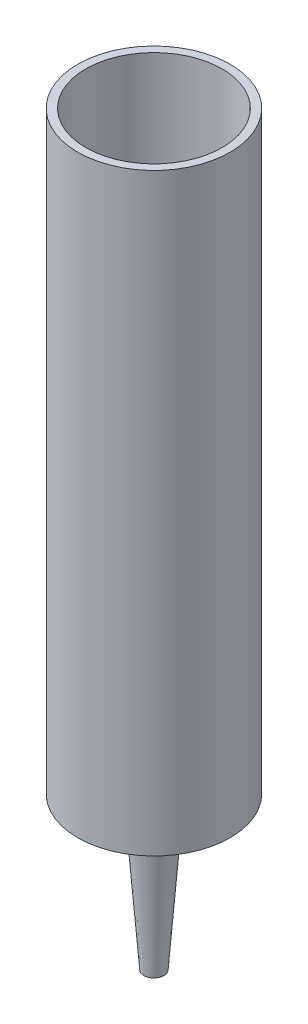
ISO-10303-21;
HEADER;
FILE_DESCRIPTION(('STEP AP214'),'2;1');
FILE_NAME('part.step','',(''),(''),'','','');
FILE_SCHEMA(('AUTOMOTIVE_DESIGN { 1 0 10303 214 1 1 1 1 }'));
ENDSEC;
DATA;
#1=APPLICATION_CONTEXT('core data for automotive mechanical design processes');
#2=APPLICATION_PROTOCOL_DEFINITION('international standard','automotive_design',2000,#1);
#3=PRODUCT_CONTEXT('',#1,'mechanical');
#4=PRODUCT('Part','Part','',(#3));
#5=PRODUCT_RELATED_PRODUCT_CATEGORY('part','',(#4));
#6=PRODUCT_DEFINITION_FORMATION('','',#4);
#7=PRODUCT_DEFINITION_CONTEXT('part definition',#1,'design');
#8=PRODUCT_DEFINITION('design','',#6,#7);
#9=PRODUCT_DEFINITION_SHAPE('','',#8);
#10=(LENGTH_UNIT() NAMED_UNIT(*) SI_UNIT(.MILLI.,.METRE.));
#11=(NAMED_UNIT(*) PLANE_ANGLE_UNIT() SI_UNIT($,.RADIAN.));
#12=(NAMED_UNIT(*) SI_UNIT($,.STERADIAN.) SOLID_ANGLE_UNIT());
#13=UNCERTAINTY_MEASURE_WITH_UNIT(LENGTH_MEASURE(1.E-05),#10,'distance_accuracy_value','');
#14=(GEOMETRIC_REPRESENTATION_CONTEXT(3) GLOBAL_UNCERTAINTY_ASSIGNED_CONTEXT((#13)) GLOBAL_UNIT_ASSIGNED_CONTEXT((#10,
#11,#12)) REPRESENTATION_CONTEXT('',''));
#15=CARTESIAN_POINT('',(0.,0.,0.));
#16=DIRECTION('',(0.,0.,1.));
#17=DIRECTION('',(1.,0.,0.));
#18=AXIS2_PLACEMENT_3D('',#15,#16,#17);
#19=CARTESIAN_POINT('',(0.,148.,0.));
#20=DIRECTION('',(0.,1.,0.));
#21=DIRECTION('',(0.,0.,1.));
#22=AXIS2_PLACEMENT_3D('',#19,#20,#21);
#23=PLANE('',#22);
#24=CARTESIAN_POINT('',(0.,148.,0.));
#25=DIRECTION('',(0.,1.,0.));
#26=DIRECTION('',(0.,0.,1.));
#27=AXIS2_PLACEMENT_3D('',#24,#25,#26);
#28=CIRCLE('',#27,19.);
#29=CARTESIAN_POINT('',(0.,148.,19.));
#30=VERTEX_POINT('',#29);
#31=EDGE_CURVE('E10',#30,#30,#28,.T.);
#32=ORIENTED_EDGE('',*,*,#31,.T.);
#33=EDGE_LOOP('',(#32));
#34=FACE_BOUND('',#33,.T.);
#35=CARTESIAN_POINT('',(0.,148.,0.));
#36=DIRECTION('',(0.,1.,0.));
#37=DIRECTION('',(0.,0.,1.));
#38=AXIS2_PLACEMENT_3D('',#35,#36,#37);
#39=CIRCLE('',#38,17.);
#40=CARTESIAN_POINT('',(0.,148.,17.));
#41=VERTEX_POINT('',#40);
#42=EDGE_CURVE('E46',#41,#41,#39,.T.);
#43=ORIENTED_EDGE('',*,*,#42,.F.);
#44=EDGE_LOOP('',(#43));
#45=FACE_BOUND('',#44,.T.);
#46=ADVANCED_FACE('F39',(#34,#45),#23,.T.);
#47=CARTESIAN_POINT('',(0.,148.,0.));
#48=DIRECTION('',(0.,-1.,0.));
#49=DIRECTION('',(0.,0.,-1.));
#50=AXIS2_PLACEMENT_3D('',#47,#48,#49);
#51=CYLINDRICAL_SURFACE('',#50,19.);
#52=ORIENTED_EDGE('',*,*,#31,.F.);
#53=EDGE_LOOP('',(#52));
#54=FACE_BOUND('',#53,.T.);
#55=CARTESIAN_POINT('',(0.,0.,0.));
#56=DIRECTION('',(0.,1.,0.));
#57=DIRECTION('',(0.,0.,1.));
#58=AXIS2_PLACEMENT_3D('',#55,#56,#57);
#59=CIRCLE('',#58,19.);
#60=CARTESIAN_POINT('',(0.,0.,19.));
#61=VERTEX_POINT('',#60);
#62=EDGE_CURVE('E55',#61,#61,#59,.T.);
#63=ORIENTED_EDGE('',*,*,#62,.T.);
#64=EDGE_LOOP('',(#63));
#65=FACE_BOUND('',#64,.T.);
#66=ADVANCED_FACE('F41',(#54,#65),#51,.T.);
#67=CARTESIAN_POINT('',(0.,148.,0.));
#68=DIRECTION('',(0.,-1.,0.));
#69=DIRECTION('',(0.,0.,-1.));
#70=AXIS2_PLACEMENT_3D('',#67,#68,#69);
#71=CYLINDRICAL_SURFACE('',#70,17.);
#72=ORIENTED_EDGE('',*,*,#42,.T.);
#73=EDGE_LOOP('',(#72));
#74=FACE_BOUND('',#73,.T.);
#75=CARTESIAN_POINT('',(0.,0.,0.));
#76=DIRECTION('',(0.,1.,0.));
#77=DIRECTION('',(0.,0.,1.));
#78=AXIS2_PLACEMENT_3D('',#75,#76,#77);
#79=CIRCLE('',#78,17.);
#80=CARTESIAN_POINT('',(0.,0.,17.));
#81=VERTEX_POINT('',#80);
#82=EDGE_CURVE('E50',#81,#81,#79,.T.);
#83=ORIENTED_EDGE('',*,*,#82,.F.);
#84=EDGE_LOOP('',(#83));
#85=FACE_BOUND('',#84,.T.);
#86=ADVANCED_FACE('F90',(#74,#85),#71,.F.);
#87=CARTESIAN_POINT('',(0.,0.,0.));
#88=DIRECTION('',(0.,1.,0.));
#89=DIRECTION('',(0.,0.,1.));
#90=AXIS2_PLACEMENT_3D('',#87,#88,#89);
#91=CONICAL_SURFACE('',#90,19.,1.22777238637419);
#92=CARTESIAN_POINT('',(0.,-5.,0.));
#93=DIRECTION('',(0.,1.,0.));
#94=DIRECTION('',(0.,0.,1.));
#95=AXIS2_PLACEMENT_3D('',#92,#93,#94);
#96=CIRCLE('',#95,5.);
#97=CARTESIAN_POINT('',(0.,-5.,5.));
#98=VERTEX_POINT('',#97);
#99=EDGE_CURVE('E68',#98,#98,#96,.T.);
#100=CARTESIAN_POINT('',(0.,-5.,5.));
#101=CARTESIAN_POINT('',(0.,-4.94791666666666,5.14583333333334));
#102=CARTESIAN_POINT('',(0.,-4.89583333333333,5.29166666666667));
#103=CARTESIAN_POINT('',(0.,-4.79166666666666,5.58333333333334));
#104=CARTESIAN_POINT('',(0.,-4.73958333333333,5.72916666666667));
#105=CARTESIAN_POINT('',(0.,-4.63541666666666,6.02083333333334));
#106=CARTESIAN_POINT('',(0.,-4.58333333333333,6.16666666666667));
#107=CARTESIAN_POINT('',(0.,-4.47916666666666,6.45833333333334));
#108=CARTESIAN_POINT('',(0.,-4.42708333333333,6.60416666666667));
#109=CARTESIAN_POINT('',(0.,-4.32291666666666,6.89583333333334));
#110=CARTESIAN_POINT('',(0.,-4.27083333333333,7.04166666666667));
#111=CARTESIAN_POINT('',(0.,-4.16666666666666,7.33333333333333));
#112=CARTESIAN_POINT('',(0.,-4.11458333333333,7.47916666666667));
#113=CARTESIAN_POINT('',(0.,-4.01041666666666,7.77083333333334));
#114=CARTESIAN_POINT('',(0.,-3.95833333333333,7.91666666666667));
#115=CARTESIAN_POINT('',(0.,-3.85416666666666,8.20833333333334));
#116=CARTESIAN_POINT('',(0.,-3.80208333333333,8.35416666666667));
#117=CARTESIAN_POINT('',(0.,-3.69791666666666,8.64583333333334));
#118=CARTESIAN_POINT('',(0.,-3.64583333333333,8.79166666666667));
#119=CARTESIAN_POINT('',(0.,-3.54166666666666,9.08333333333334));
#120=CARTESIAN_POINT('',(0.,-3.48958333333333,9.22916666666667));
#121=CARTESIAN_POINT('',(0.,-3.38541666666666,9.52083333333334));
#122=CARTESIAN_POINT('',(0.,-3.33333333333333,9.66666666666667));
#123=CARTESIAN_POINT('',(0.,-3.22916666666666,9.95833333333333));
#124=CARTESIAN_POINT('',(0.,-3.17708333333333,10.1041666666667));
#125=CARTESIAN_POINT('',(0.,-3.07291666666666,10.3958333333333));
#126=CARTESIAN_POINT('',(0.,-3.02083333333333,10.5416666666667));
#127=CARTESIAN_POINT('',(0.,-2.91666666666666,10.8333333333333));
#128=CARTESIAN_POINT('',(0.,-2.86458333333333,10.9791666666667));
#129=CARTESIAN_POINT('',(0.,-2.76041666666666,11.2708333333333));
#130=CARTESIAN_POINT('',(0.,-2.70833333333333,11.4166666666667));
#131=CARTESIAN_POINT('',(0.,-2.60416666666666,11.7083333333333));
#132=CARTESIAN_POINT('',(0.,-2.55208333333333,11.8541666666667));
#133=CARTESIAN_POINT('',(0.,-2.44791666666666,12.1458333333333));
#134=CARTESIAN_POINT('',(0.,-2.39583333333333,12.2916666666667));
#135=CARTESIAN_POINT('',(0.,-2.29166666666666,12.5833333333333));
#136=CARTESIAN_POINT('',(0.,-2.23958333333333,12.7291666666667));
#137=CARTESIAN_POINT('',(0.,-2.13541666666666,13.0208333333333));
#138=CARTESIAN_POINT('',(0.,-2.08333333333333,13.1666666666667));
#139=CARTESIAN_POINT('',(0.,-1.97916666666667,13.4583333333333));
#140=CARTESIAN_POINT('',(0.,-1.92708333333333,13.6041666666667));
#141=CARTESIAN_POINT('',(0.,-1.82291666666666,13.8958333333333));
#142=CARTESIAN_POINT('',(0.,-1.77083333333333,14.0416666666667));
#143=CARTESIAN_POINT('',(0.,-1.66666666666667,14.3333333333333));
#144=CARTESIAN_POINT('',(0.,-1.61458333333333,14.4791666666667));
#145=CARTESIAN_POINT('',(0.,-1.51041666666667,14.7708333333333));
#146=CARTESIAN_POINT('',(0.,-1.45833333333333,14.9166666666667));
#147=CARTESIAN_POINT('',(0.,-1.35416666666667,15.2083333333333));
#148=CARTESIAN_POINT('',(0.,-1.30208333333333,15.3541666666667));
#149=CARTESIAN_POINT('',(0.,-1.19791666666667,15.6458333333333));
#150=CARTESIAN_POINT('',(0.,-1.14583333333333,15.7916666666667));
#151=CARTESIAN_POINT('',(0.,-1.04166666666667,16.0833333333333));
#152=CARTESIAN_POINT('',(0.,-0.989583333333333,16.2291666666667));
#153=CARTESIAN_POINT('',(0.,-0.885416666666666,16.5208333333333));
#154=CARTESIAN_POINT('',(0.,-0.833333333333332,16.6666666666667));
#155=CARTESIAN_POINT('',(0.,-0.729166666666666,16.9583333333333));
#156=CARTESIAN_POINT('',(0.,-0.677083333333332,17.1041666666667));
#157=CARTESIAN_POINT('',(0.,-0.572916666666666,17.3958333333333));
#158=CARTESIAN_POINT('',(0.,-0.520833333333333,17.5416666666667));
#159=CARTESIAN_POINT('',(0.,-0.416666666666666,17.8333333333333));
#160=CARTESIAN_POINT('',(0.,-0.364583333333333,17.9791666666667));
#161=CARTESIAN_POINT('',(0.,-0.260416666666666,18.2708333333333));
#162=CARTESIAN_POINT('',(0.,-0.208333333333333,18.4166666666667));
#163=CARTESIAN_POINT('',(0.,-0.104166666666667,18.7083333333333));
#164=CARTESIAN_POINT('',(0.,-0.0520833333333333,18.8541666666667));
#165=CARTESIAN_POINT('',(0.,0.,19.));
#166=B_SPLINE_CURVE_WITH_KNOTS('',3,(#100,#101,#102,#103,#104,#105,#106,#107,#108,#109,#110,
#111,#112,#113,#114,#115,#116,#117,#118,#119,#120,#121,#122,#123,#124,#125,#126,#127,#128,#129,
#130,#131,#132,#133,#134,#135,#136,#137,#138,#139,#140,#141,#142,#143,#144,#145,#146,#147,#148,
#149,#150,#151,#152,#153,#154,#155,#156,#157,#158,#159,#160,#161,#162,#163,#164,#165),
.UNSPECIFIED.,.F.,.F.,(4,2,2,2,2,2,2,2,2,2,2,2,2,2,2,2,2,2,2,2,2,2,2,2,2,2,2,2,2,2,2,2,4),(0.,
0.464564648353705,0.929129296707406,1.39369394506111,1.85825859341481,2.32282324176851,
2.78738789012222,3.25195253847592,3.71651718682963,4.18108183518333,4.64564648353703,
5.11021113189074,5.57477578024444,6.03934042859814,6.50390507695185,6.96846972530555,
7.43303437365925,7.89759902201296,8.36216367036666,8.82672831872036,9.29129296707406,
9.75585761542777,10.2204222637815,10.6849869121352,11.1495515604889,11.6141162088426,
12.0786808571963,12.54324550555,13.0078101539037,13.4723748022574,13.9369394506111,
14.4015040989648,14.8660687473185),.UNSPECIFIED.);
#167=EDGE_CURVE('BSEAM72',#98,#61,#166,.T.);
#168=ORIENTED_EDGE('',*,*,#99,.T.);
#169=ORIENTED_EDGE('',*,*,#62,.F.);
#170=ORIENTED_EDGE('',*,*,#167,.T.);
#171=ORIENTED_EDGE('',*,*,#167,.F.);
#172=EDGE_LOOP('',(#168,#170,#169,#171));
#173=FACE_BOUND('',#172,.T.);
#174=ADVANCED_FACE('F72',(#173),#91,.T.);
#175=CARTESIAN_POINT('',(0.,-4.6329254727475,0.));
#176=DIRECTION('',(0.,1.,0.));
#177=DIRECTION('',(0.,0.,1.));
#178=AXIS2_PLACEMENT_3D('',#175,#176,#177);
#179=CONICAL_SURFACE('',#178,4.02780867630701,1.22777238637419);
#180=CARTESIAN_POINT('',(0.,-4.6329254727475,0.));
#181=DIRECTION('',(0.,1.,0.));
#182=DIRECTION('',(0.,0.,1.));
#183=AXIS2_PLACEMENT_3D('',#180,#181,#182);
#184=CIRCLE('',#183,4.02780867630701);
#185=CARTESIAN_POINT('',(0.,-4.6329254727475,4.02780867630701));
#186=VERTEX_POINT('',#185);
#187=EDGE_CURVE('E59',#186,#186,#184,.T.);
#188=CARTESIAN_POINT('',(0.,0.,17.));
#189=CARTESIAN_POINT('',(0.,-0.0482596403411196,16.8648730070449));
#190=CARTESIAN_POINT('',(0.,-0.0965192806822393,16.7297460140897));
#191=CARTESIAN_POINT('',(0.,-0.193038561364479,16.4594920281795));
#192=CARTESIAN_POINT('',(0.,-0.241298201705599,16.3243650352243));
#193=CARTESIAN_POINT('',(0.,-0.337817482387838,16.0541110493141));
#194=CARTESIAN_POINT('',(0.,-0.386077122728958,15.9189840563589));
#195=CARTESIAN_POINT('',(0.,-0.482596403411198,15.6487300704486));
#196=CARTESIAN_POINT('',(0.,-0.530856043752318,15.5136030774935));
#197=CARTESIAN_POINT('',(0.,-0.627375324434557,15.2433490915832));
#198=CARTESIAN_POINT('',(0.,-0.675634964775677,15.1082220986281));
#199=CARTESIAN_POINT('',(0.,-0.772154245457916,14.8379681127178));
#200=CARTESIAN_POINT('',(0.,-0.820413885799036,14.7028411197627));
#201=CARTESIAN_POINT('',(0.,-0.916933166481276,14.4325871338524));
#202=CARTESIAN_POINT('',(0.,-0.965192806822395,14.2974601408973));
#203=CARTESIAN_POINT('',(0.,-1.06171208750463,14.027206154987));
#204=CARTESIAN_POINT('',(0.,-1.10997172784575,13.8920791620319));
#205=CARTESIAN_POINT('',(0.,-1.20649100852799,13.6218251761216));
#206=CARTESIAN_POINT('',(0.,-1.25475064886911,13.4866981831665));
#207=CARTESIAN_POINT('',(0.,-1.35126992955135,13.2164441972562));
#208=CARTESIAN_POINT('',(0.,-1.39952956989247,13.0813172043011));
#209=CARTESIAN_POINT('',(0.,-1.49604885057471,12.8110632183908));
#210=CARTESIAN_POINT('',(0.,-1.54430849091583,12.6759362254357));
#211=CARTESIAN_POINT('',(0.,-1.64082777159807,12.4056822395254));
#212=CARTESIAN_POINT('',(0.,-1.68908741193919,12.2705552465703));
#213=CARTESIAN_POINT('',(0.,-1.78560669262143,12.00030126066));
#214=CARTESIAN_POINT('',(0.,-1.83386633296255,11.8651742677049));
#215=CARTESIAN_POINT('',(0.,-1.93038561364479,11.5949202817946));
#216=CARTESIAN_POINT('',(0.,-1.97864525398591,11.4597932888395));
#217=CARTESIAN_POINT('',(0.,-2.07516453466815,11.1895393029292));
#218=CARTESIAN_POINT('',(0.,-2.12342417500927,11.054412309974));
#219=CARTESIAN_POINT('',(0.,-2.21994345569151,10.7841583240638));
#220=CARTESIAN_POINT('',(0.,-2.26820309603263,10.6490313311086));
#221=CARTESIAN_POINT('',(0.,-2.36472237671487,10.3787773451984));
#222=CARTESIAN_POINT('',(0.,-2.41298201705599,10.2436503522432));
#223=CARTESIAN_POINT('',(0.,-2.50950129773823,9.97339636633297));
#224=CARTESIAN_POINT('',(0.,-2.55776093807935,9.83826937337783));
#225=CARTESIAN_POINT('',(0.,-2.65428021876159,9.56801538746756));
#226=CARTESIAN_POINT('',(0.,-2.70253985910271,9.43288839451242));
#227=CARTESIAN_POINT('',(0.,-2.79905913978495,9.16263440860215));
#228=CARTESIAN_POINT('',(0.,-2.84731878012607,9.02750741564702));
#229=CARTESIAN_POINT('',(0.,-2.94383806080831,8.75725342973675));
#230=CARTESIAN_POINT('',(0.,-2.99209770114942,8.62212643678161));
#231=CARTESIAN_POINT('',(0.,-3.08861698183166,8.35187245087134));
#232=CARTESIAN_POINT('',(0.,-3.13687662217278,8.2167454579162));
#233=CARTESIAN_POINT('',(0.,-3.23339590285502,7.94649147200593));
#234=CARTESIAN_POINT('',(0.,-3.28165554319614,7.8113644790508));
#235=CARTESIAN_POINT('',(0.,-3.37817482387838,7.54111049314053));
#236=CARTESIAN_POINT('',(0.,-3.4264344642195,7.40598350018539));
#237=CARTESIAN_POINT('',(0.,-3.52295374490174,7.13572951427512));
#238=CARTESIAN_POINT('',(0.,-3.57121338524286,7.00060252131999));
#239=CARTESIAN_POINT('',(0.,-3.6677326659251,6.73034853540972));
#240=CARTESIAN_POINT('',(0.,-3.71599230626622,6.59522154245458));
#241=CARTESIAN_POINT('',(0.,-3.81251158694846,6.32496755654431));
#242=CARTESIAN_POINT('',(0.,-3.86077122728958,6.18984056358917));
#243=CARTESIAN_POINT('',(0.,-3.95729050797182,5.9195865776789));
#244=CARTESIAN_POINT('',(0.,-4.00555014831294,5.78445958472377));
#245=CARTESIAN_POINT('',(0.,-4.10206942899518,5.5142055988135));
#246=CARTESIAN_POINT('',(0.,-4.1503290693363,5.37907860585836));
#247=CARTESIAN_POINT('',(0.,-4.24684835001854,5.10882461994809));
#248=CARTESIAN_POINT('',(0.,-4.29510799035966,4.97369762699296));
#249=CARTESIAN_POINT('',(0.,-4.3916272710419,4.70344364108268));
#250=CARTESIAN_POINT('',(0.,-4.43988691138302,4.56831664812755));
#251=CARTESIAN_POINT('',(0.,-4.53640619206526,4.29806266221728));
#252=CARTESIAN_POINT('',(0.,-4.58466583240638,4.16293566926214));
#253=CARTESIAN_POINT('',(0.,-4.6329254727475,4.02780867630701));
#254=B_SPLINE_CURVE_WITH_KNOTS('',3,(#188,#189,#190,#191,#192,#193,#194,#195,#196,#197,#198,
#199,#200,#201,#202,#203,#204,#205,#206,#207,#208,#209,#210,#211,#212,#213,#214,#215,#216,#217,
#218,#219,#220,#221,#222,#223,#224,#225,#226,#227,#228,#229,#230,#231,#232,#233,#234,#235,#236,
#237,#238,#239,#240,#241,#242,#243,#244,#245,#246,#247,#248,#249,#250,#251,#252,#253),
.UNSPECIFIED.,.F.,.F.,(4,2,2,2,2,2,2,2,2,2,2,2,2,2,2,2,2,2,2,2,2,2,2,2,2,2,2,2,2,2,2,2,4),(0.,
0.430458678619171,0.860917357238342,1.29137603585752,1.72183471447669,2.15229339309586,
2.58275207171503,3.0132107503342,3.44366942895337,3.87412810757254,4.30458678619171,
4.73504546481088,5.16550414343005,5.59596282204923,6.0264215006684,6.45688017928757,
6.88733885790674,7.31779753652591,7.74825621514508,8.17871489376425,8.60917357238343,
9.0396322510026,9.47009092962177,9.90054960824094,10.3310082868601,10.7614669654793,
11.1919256440985,11.6223843227176,12.0528430013368,12.483301679956,12.9137603585751,
13.3442190371943,13.7746777158135),.UNSPECIFIED.);
#255=EDGE_CURVE('BSEAM98',#81,#186,#254,.T.);
#256=ORIENTED_EDGE('',*,*,#82,.T.);
#257=ORIENTED_EDGE('',*,*,#187,.F.);
#258=ORIENTED_EDGE('',*,*,#255,.T.);
#259=ORIENTED_EDGE('',*,*,#255,.F.);
#260=EDGE_LOOP('',(#256,#258,#257,#259));
#261=FACE_BOUND('',#260,.T.);
#262=ADVANCED_FACE('F98',(#261),#179,.F.);
#263=CARTESIAN_POINT('',(0.,-38.,0.));
#264=DIRECTION('',(0.,1.,0.));
#265=DIRECTION('',(0.,0.,1.));
#266=AXIS2_PLACEMENT_3D('',#263,#264,#265);
#267=CONICAL_SURFACE('',#266,1.49999999999998,0.0756131432368305);
#268=ORIENTED_EDGE('',*,*,#187,.T.);
#269=EDGE_LOOP('',(#268));
#270=FACE_BOUND('',#269,.T.);
#271=CARTESIAN_POINT('',(0.,-38.,0.));
#272=DIRECTION('',(0.,1.,0.));
#273=DIRECTION('',(0.,0.,1.));
#274=AXIS2_PLACEMENT_3D('',#271,#272,#273);
#275=CIRCLE('',#274,1.49999999999998);
#276=CARTESIAN_POINT('',(0.,-38.,1.49999999999998));
#277=VERTEX_POINT('',#276);
#278=EDGE_CURVE('E62',#277,#277,#275,.T.);
#279=ORIENTED_EDGE('',*,*,#278,.F.);
#280=EDGE_LOOP('',(#279));
#281=FACE_BOUND('',#280,.T.);
#282=ADVANCED_FACE('F83',(#270,#281),#267,.F.);
#283=CARTESIAN_POINT('',(-2.49999999999998,-38.,0.));
#284=DIRECTION('',(0.,-1.,0.));
#285=DIRECTION('',(0.,0.,-1.));
#286=AXIS2_PLACEMENT_3D('',#283,#284,#285);
#287=PLANE('',#286);
#288=ORIENTED_EDGE('',*,*,#278,.T.);
#289=EDGE_LOOP('',(#288));
#290=FACE_BOUND('',#289,.T.);
#291=CARTESIAN_POINT('',(0.,-38.,0.));
#292=DIRECTION('',(0.,1.,0.));
#293=DIRECTION('',(0.,0.,1.));
#294=AXIS2_PLACEMENT_3D('',#291,#292,#293);
#295=CIRCLE('',#294,2.49999999999998);
#296=CARTESIAN_POINT('',(0.,-38.,2.49999999999998));
#297=VERTEX_POINT('',#296);
#298=EDGE_CURVE('E65',#297,#297,#295,.T.);
#299=ORIENTED_EDGE('',*,*,#298,.F.);
#300=EDGE_LOOP('',(#299));
#301=FACE_BOUND('',#300,.T.);
#302=ADVANCED_FACE('F77',(#290,#301),#287,.T.);
#303=CARTESIAN_POINT('',(0.,-5.,0.));
#304=DIRECTION('',(0.,1.,0.));
#305=DIRECTION('',(0.,0.,1.));
#306=AXIS2_PLACEMENT_3D('',#303,#304,#305);
#307=CONICAL_SURFACE('',#306,5.,0.0756131432368304);
#308=ORIENTED_EDGE('',*,*,#298,.T.);
#309=EDGE_LOOP('',(#308));
#310=FACE_BOUND('',#309,.T.);
#311=ORIENTED_EDGE('',*,*,#99,.F.);
#312=EDGE_LOOP('',(#311));
#313=FACE_BOUND('',#312,.T.);
#314=ADVANCED_FACE('F75',(#310,#313),#307,.T.);
#315=CLOSED_SHELL('',(#46,#66,#86,#174,#262,#282,#302,#314));
#316=MANIFOLD_SOLID_BREP('B2',#315);
#317=ADVANCED_BREP_SHAPE_REPRESENTATION('',(#18,#316),#14);
#318=SHAPE_DEFINITION_REPRESENTATION(#9,#317);
ENDSEC;
END-ISO-10303-21;
